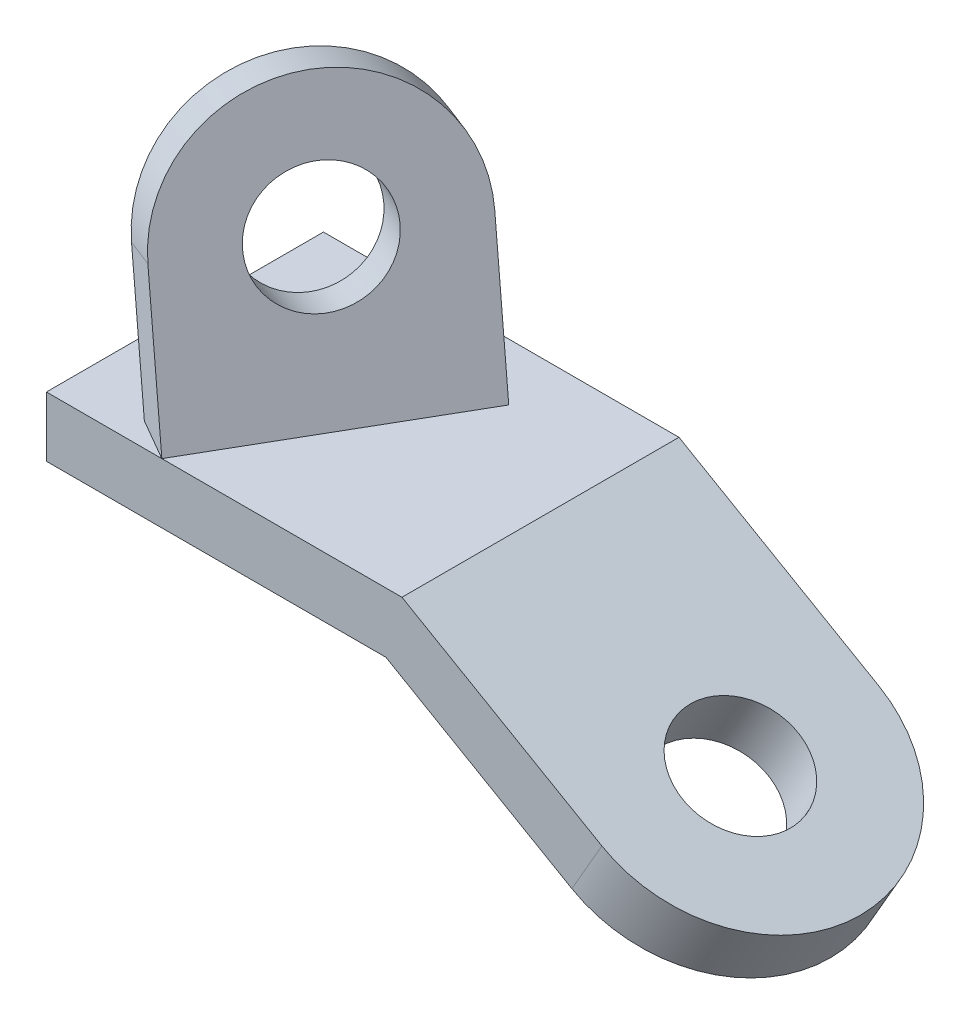
ISO-10303-21;
HEADER;
FILE_DESCRIPTION(('STEP AP214'),'2;1');
FILE_NAME('part.step','',(''),(''),'','','');
FILE_SCHEMA(('AUTOMOTIVE_DESIGN { 1 0 10303 214 1 1 1 1 }'));
ENDSEC;
DATA;
#1=APPLICATION_CONTEXT('core data for automotive mechanical design processes');
#2=APPLICATION_PROTOCOL_DEFINITION('international standard','automotive_design',2000,#1);
#3=PRODUCT_CONTEXT('',#1,'mechanical');
#4=PRODUCT('Part','Part','',(#3));
#5=PRODUCT_RELATED_PRODUCT_CATEGORY('part','',(#4));
#6=PRODUCT_DEFINITION_FORMATION('','',#4);
#7=PRODUCT_DEFINITION_CONTEXT('part definition',#1,'design');
#8=PRODUCT_DEFINITION('design','',#6,#7);
#9=PRODUCT_DEFINITION_SHAPE('','',#8);
#10=(LENGTH_UNIT() NAMED_UNIT(*) SI_UNIT(.MILLI.,.METRE.));
#11=(NAMED_UNIT(*) PLANE_ANGLE_UNIT() SI_UNIT($,.RADIAN.));
#12=(NAMED_UNIT(*) SI_UNIT($,.STERADIAN.) SOLID_ANGLE_UNIT());
#13=UNCERTAINTY_MEASURE_WITH_UNIT(LENGTH_MEASURE(1.E-05),#10,'distance_accuracy_value','');
#14=(GEOMETRIC_REPRESENTATION_CONTEXT(3) GLOBAL_UNCERTAINTY_ASSIGNED_CONTEXT((#13)) GLOBAL_UNIT_ASSIGNED_CONTEXT((#10,
#11,#12)) REPRESENTATION_CONTEXT('',''));
#15=CARTESIAN_POINT('',(0.,0.,0.));
#16=DIRECTION('',(0.,0.,1.));
#17=DIRECTION('',(1.,0.,0.));
#18=AXIS2_PLACEMENT_3D('',#15,#16,#17);
#19=CARTESIAN_POINT('',(0.,0.,30.));
#20=DIRECTION('',(1.,0.,0.));
#21=DIRECTION('',(0.,0.,-1.));
#22=AXIS2_PLACEMENT_3D('',#19,#20,#21);
#23=PLANE('',#22);
#24=DIRECTION('',(0.,-1.,0.));
#25=VECTOR('',#24,1.);
#26=CARTESIAN_POINT('',(0.,0.,-30.));
#27=LINE('',#26,#25);
#28=CARTESIAN_POINT('',(0.,13.,-30.));
#29=VERTEX_POINT('',#28);
#30=CARTESIAN_POINT('',(0.,0.,-30.));
#31=VERTEX_POINT('',#30);
#32=EDGE_CURVE('E207',#29,#31,#27,.T.);
#33=ORIENTED_EDGE('',*,*,#32,.T.);
#34=DIRECTION('',(0.,0.,-1.));
#35=VECTOR('',#34,1.);
#36=CARTESIAN_POINT('',(0.,0.,30.));
#37=LINE('',#36,#35);
#38=CARTESIAN_POINT('',(0.,0.,30.));
#39=VERTEX_POINT('',#38);
#40=EDGE_CURVE('E241',#39,#31,#37,.T.);
#41=ORIENTED_EDGE('',*,*,#40,.F.);
#42=DIRECTION('',(0.,-1.,0.));
#43=VECTOR('',#42,1.);
#44=CARTESIAN_POINT('',(0.,0.,30.));
#45=LINE('',#44,#43);
#46=CARTESIAN_POINT('',(0.,13.,30.));
#47=VERTEX_POINT('',#46);
#48=EDGE_CURVE('E209',#47,#39,#45,.T.);
#49=ORIENTED_EDGE('',*,*,#48,.F.);
#50=DIRECTION('',(0.,0.,-1.));
#51=VECTOR('',#50,1.);
#52=CARTESIAN_POINT('',(0.,13.,30.));
#53=LINE('',#52,#51);
#54=EDGE_CURVE('E223',#47,#29,#53,.T.);
#55=ORIENTED_EDGE('',*,*,#54,.T.);
#56=EDGE_LOOP('',(#33,#41,#49,#55));
#57=FACE_BOUND('',#56,.T.);
#58=ADVANCED_FACE('F82',(#57),#23,.F.);
#59=CARTESIAN_POINT('',(0.,0.,30.));
#60=DIRECTION('',(0.,1.,0.));
#61=DIRECTION('',(0.,0.,1.));
#62=AXIS2_PLACEMENT_3D('',#59,#60,#61);
#63=PLANE('',#62);
#64=DIRECTION('',(1.,0.,0.));
#65=VECTOR('',#64,1.);
#66=CARTESIAN_POINT('',(0.,0.,-30.));
#67=LINE('',#66,#65);
#68=CARTESIAN_POINT('',(73.5166604983954,0.,-30.));
#69=VERTEX_POINT('',#68);
#70=EDGE_CURVE('E229',#31,#69,#67,.T.);
#71=ORIENTED_EDGE('',*,*,#70,.T.);
#72=DIRECTION('',(0.,0.,-1.));
#73=VECTOR('',#72,1.);
#74=CARTESIAN_POINT('',(73.5166604983954,0.,30.));
#75=LINE('',#74,#73);
#76=CARTESIAN_POINT('',(73.5166604983954,0.,30.));
#77=VERTEX_POINT('',#76);
#78=EDGE_CURVE('E242',#77,#69,#75,.T.);
#79=ORIENTED_EDGE('',*,*,#78,.F.);
#80=DIRECTION('',(1.,0.,0.));
#81=VECTOR('',#80,1.);
#82=CARTESIAN_POINT('',(0.,0.,30.));
#83=LINE('',#82,#81);
#84=EDGE_CURVE('E213',#39,#77,#83,.T.);
#85=ORIENTED_EDGE('',*,*,#84,.F.);
#86=ORIENTED_EDGE('',*,*,#40,.T.);
#87=EDGE_LOOP('',(#71,#79,#85,#86));
#88=FACE_BOUND('',#87,.T.);
#89=ADVANCED_FACE('F249',(#88),#63,.F.);
#90=CARTESIAN_POINT('',(73.5166604983954,0.,30.));
#91=DIRECTION('',(0.500000000000001,0.866025403784438,0.));
#92=DIRECTION('',(-0.866025403784438,0.500000000000001,0.));
#93=AXIS2_PLACEMENT_3D('',#90,#91,#92);
#94=PLANE('',#93);
#95=CARTESIAN_POINT('',(113.801270189222,-23.2583302491977,0.));
#96=DIRECTION('',(0.500000000000001,0.866025403784438,0.));
#97=DIRECTION('',(-0.866025403784438,0.500000000000001,0.));
#98=AXIS2_PLACEMENT_3D('',#95,#96,#97);
#99=CIRCLE('',#98,12.5);
#100=CARTESIAN_POINT('',(102.975952641916,-17.0083302491977,0.));
#101=VERTEX_POINT('',#100);
#102=EDGE_CURVE('E206',#101,#101,#99,.F.);
#103=ORIENTED_EDGE('',*,*,#102,.F.);
#104=EDGE_LOOP('',(#103));
#105=FACE_BOUND('',#104,.T.);
#106=CARTESIAN_POINT('',(113.801270189222,-23.2583302491977,0.));
#107=DIRECTION('',(0.500000000000001,0.866025403784438,0.));
#108=DIRECTION('',(-0.866025403784438,0.500000000000001,0.));
#109=AXIS2_PLACEMENT_3D('',#106,#107,#108);
#110=CIRCLE('',#109,30.);
#111=CARTESIAN_POINT('',(113.801270189222,-23.2583302491977,-30.));
#112=VERTEX_POINT('',#111);
#113=CARTESIAN_POINT('',(113.801270189222,-23.2583302491977,30.));
#114=VERTEX_POINT('',#113);
#115=EDGE_CURVE('E196',#112,#114,#110,.F.);
#116=ORIENTED_EDGE('',*,*,#115,.T.);
#117=DIRECTION('',(0.866025403784438,-0.500000000000001,0.));
#118=VECTOR('',#117,1.);
#119=CARTESIAN_POINT('',(73.5166604983954,0.,30.));
#120=LINE('',#119,#118);
#121=EDGE_CURVE('E216',#77,#114,#120,.T.);
#122=ORIENTED_EDGE('',*,*,#121,.F.);
#123=ORIENTED_EDGE('',*,*,#78,.T.);
#124=DIRECTION('',(0.866025403784438,-0.500000000000001,0.));
#125=VECTOR('',#124,1.);
#126=CARTESIAN_POINT('',(73.5166604983954,0.,-30.));
#127=LINE('',#126,#125);
#128=EDGE_CURVE('E228',#69,#112,#127,.T.);
#129=ORIENTED_EDGE('',*,*,#128,.T.);
#130=EDGE_LOOP('',(#116,#122,#123,#129));
#131=FACE_BOUND('',#130,.T.);
#132=ADVANCED_FACE('F261',(#105,#131),#94,.F.);
#133=CARTESIAN_POINT('',(77.,13.,30.));
#134=DIRECTION('',(-0.500000000000001,-0.866025403784438,0.));
#135=DIRECTION('',(0.866025403784438,-0.500000000000001,0.));
#136=AXIS2_PLACEMENT_3D('',#133,#134,#135);
#137=PLANE('',#136);
#138=CARTESIAN_POINT('',(120.301270189222,-12.,0.));
#139=DIRECTION('',(0.500000000000001,0.866025403784438,0.));
#140=DIRECTION('',(-0.866025403784438,0.500000000000001,0.));
#141=AXIS2_PLACEMENT_3D('',#138,#139,#140);
#142=CIRCLE('',#141,12.5);
#143=CARTESIAN_POINT('',(109.475952641916,-5.75000000000001,0.));
#144=VERTEX_POINT('',#143);
#145=EDGE_CURVE('E201',#144,#144,#142,.T.);
#146=ORIENTED_EDGE('',*,*,#145,.F.);
#147=EDGE_LOOP('',(#146));
#148=FACE_BOUND('',#147,.T.);
#149=DIRECTION('',(-0.866025403784438,0.500000000000001,0.));
#150=VECTOR('',#149,1.);
#151=CARTESIAN_POINT('',(77.,13.,30.));
#152=LINE('',#151,#150);
#153=CARTESIAN_POINT('',(120.301270189222,-12.,30.));
#154=VERTEX_POINT('',#153);
#155=CARTESIAN_POINT('',(77.,13.,30.));
#156=VERTEX_POINT('',#155);
#157=EDGE_CURVE('E218',#154,#156,#152,.T.);
#158=ORIENTED_EDGE('',*,*,#157,.F.);
#159=CARTESIAN_POINT('',(120.301270189222,-12.,0.));
#160=DIRECTION('',(0.500000000000001,0.866025403784438,0.));
#161=DIRECTION('',(-0.866025403784438,0.500000000000001,0.));
#162=AXIS2_PLACEMENT_3D('',#159,#160,#161);
#163=CIRCLE('',#162,30.);
#164=CARTESIAN_POINT('',(120.301270189222,-12.,-30.));
#165=VERTEX_POINT('',#164);
#166=EDGE_CURVE('E103',#154,#165,#163,.T.);
#167=ORIENTED_EDGE('',*,*,#166,.T.);
#168=DIRECTION('',(-0.866025403784438,0.500000000000001,0.));
#169=VECTOR('',#168,1.);
#170=CARTESIAN_POINT('',(77.,13.,-30.));
#171=LINE('',#170,#169);
#172=CARTESIAN_POINT('',(77.,13.,-30.));
#173=VERTEX_POINT('',#172);
#174=EDGE_CURVE('E234',#165,#173,#171,.T.);
#175=ORIENTED_EDGE('',*,*,#174,.T.);
#176=DIRECTION('',(0.,0.,-1.));
#177=VECTOR('',#176,1.);
#178=CARTESIAN_POINT('',(77.,13.,30.));
#179=LINE('',#178,#177);
#180=EDGE_CURVE('E236',#156,#173,#179,.T.);
#181=ORIENTED_EDGE('',*,*,#180,.F.);
#182=EDGE_LOOP('',(#158,#167,#175,#181));
#183=FACE_BOUND('',#182,.T.);
#184=ADVANCED_FACE('F272',(#148,#183),#137,.F.);
#185=CARTESIAN_POINT('',(0.,13.,30.));
#186=DIRECTION('',(0.,-1.,0.));
#187=DIRECTION('',(0.,0.,-1.));
#188=AXIS2_PLACEMENT_3D('',#185,#186,#187);
#189=PLANE('',#188);
#190=DIRECTION('',(-0.500000000000004,0.,0.866025403784436));
#191=VECTOR('',#190,1.);
#192=CARTESIAN_POINT('',(9.78424527831939,13.,35.6489366452551));
#193=LINE('',#192,#191);
#194=CARTESIAN_POINT('',(43.5342452783197,13.,-22.8077781101945));
#195=VERTEX_POINT('',#194);
#196=CARTESIAN_POINT('',(16.0342452783195,13.,24.8236190979495));
#197=VERTEX_POINT('',#196);
#198=EDGE_CURVE('E86',#195,#197,#193,.T.);
#199=ORIENTED_EDGE('',*,*,#198,.F.);
#200=DIRECTION('',(0.866025403784436,0.,0.500000000000004));
#201=VECTOR('',#200,1.);
#202=CARTESIAN_POINT('',(33.7500000000003,13.,-28.4567147554496));
#203=LINE('',#202,#201);
#204=CARTESIAN_POINT('',(52.5000000000002,13.,-17.631397208144));
#205=VERTEX_POINT('',#204);
#206=EDGE_CURVE('E12',#195,#205,#203,.T.);
#207=ORIENTED_EDGE('',*,*,#206,.T.);
#208=DIRECTION('',(0.500000000000004,0.,-0.866025403784436));
#209=VECTOR('',#208,1.);
#210=CARTESIAN_POINT('',(52.5000000000002,13.,-17.631397208144));
#211=LINE('',#210,#209);
#212=CARTESIAN_POINT('',(25.,13.,30.));
#213=VERTEX_POINT('',#212);
#214=EDGE_CURVE('E182',#213,#205,#211,.T.);
#215=ORIENTED_EDGE('',*,*,#214,.F.);
#216=DIRECTION('',(-1.,0.,0.));
#217=VECTOR('',#216,1.);
#218=CARTESIAN_POINT('',(0.,13.,30.));
#219=LINE('',#218,#217);
#220=EDGE_CURVE('E225',#156,#213,#219,.T.);
#221=ORIENTED_EDGE('',*,*,#220,.F.);
#222=ORIENTED_EDGE('',*,*,#180,.T.);
#223=DIRECTION('',(-1.,0.,0.));
#224=VECTOR('',#223,1.);
#225=CARTESIAN_POINT('',(0.,13.,-30.));
#226=LINE('',#225,#224);
#227=EDGE_CURVE('E212',#173,#29,#226,.T.);
#228=ORIENTED_EDGE('',*,*,#227,.T.);
#229=ORIENTED_EDGE('',*,*,#54,.F.);
#230=EDGE_CURVE('E222',#213,#47,#219,.T.);
#231=ORIENTED_EDGE('',*,*,#230,.F.);
#232=DIRECTION('',(-0.866025403784436,0.,-0.500000000000004));
#233=VECTOR('',#232,1.);
#234=CARTESIAN_POINT('',(6.2500000000001,13.,19.1746824526945));
#235=LINE('',#234,#233);
#236=EDGE_CURVE('E194',#213,#197,#235,.T.);
#237=ORIENTED_EDGE('',*,*,#236,.T.);
#238=EDGE_LOOP('',(#199,#207,#215,#221,#222,#228,#229,#231,#237));
#239=FACE_BOUND('',#238,.T.);
#240=ADVANCED_FACE('F267',(#239),#189,.F.);
#241=CARTESIAN_POINT('',(0.,0.,30.));
#242=DIRECTION('',(0.,0.,-1.));
#243=DIRECTION('',(-1.,0.,0.));
#244=AXIS2_PLACEMENT_3D('',#241,#242,#243);
#245=PLANE('',#244);
#246=ORIENTED_EDGE('',*,*,#121,.T.);
#247=DIRECTION('',(0.500000000000001,0.866025403784438,0.));
#248=VECTOR('',#247,1.);
#249=CARTESIAN_POINT('',(78.8550791008311,-83.7869087453011,30.));
#250=LINE('',#249,#248);
#251=EDGE_CURVE('E198',#114,#154,#250,.T.);
#252=ORIENTED_EDGE('',*,*,#251,.T.);
#253=ORIENTED_EDGE('',*,*,#157,.T.);
#254=ORIENTED_EDGE('',*,*,#220,.T.);
#255=ORIENTED_EDGE('',*,*,#230,.T.);
#256=ORIENTED_EDGE('',*,*,#48,.T.);
#257=ORIENTED_EDGE('',*,*,#84,.T.);
#258=EDGE_LOOP('',(#246,#252,#253,#254,#255,#256,#257));
#259=FACE_BOUND('',#258,.T.);
#260=ADVANCED_FACE('F262',(#259),#245,.F.);
#261=CARTESIAN_POINT('',(0.,0.,-30.));
#262=DIRECTION('',(0.,0.,-1.));
#263=DIRECTION('',(-1.,0.,0.));
#264=AXIS2_PLACEMENT_3D('',#261,#262,#263);
#265=PLANE('',#264);
#266=DIRECTION('',(0.500000000000001,0.866025403784438,0.));
#267=VECTOR('',#266,1.);
#268=CARTESIAN_POINT('',(78.8550791008311,-83.7869087453011,-30.));
#269=LINE('',#268,#267);
#270=EDGE_CURVE('E203',#112,#165,#269,.T.);
#271=ORIENTED_EDGE('',*,*,#270,.F.);
#272=ORIENTED_EDGE('',*,*,#128,.F.);
#273=ORIENTED_EDGE('',*,*,#70,.F.);
#274=ORIENTED_EDGE('',*,*,#32,.F.);
#275=ORIENTED_EDGE('',*,*,#227,.F.);
#276=ORIENTED_EDGE('',*,*,#174,.F.);
#277=EDGE_LOOP('',(#271,#272,#273,#274,#275,#276));
#278=FACE_BOUND('',#277,.T.);
#279=ADVANCED_FACE('F260',(#278),#265,.T.);
#280=CARTESIAN_POINT('',(78.8550791008311,-83.7869087453011,0.));
#281=DIRECTION('',(0.500000000000001,0.866025403784438,0.));
#282=DIRECTION('',(-0.866025403784438,0.500000000000001,0.));
#283=AXIS2_PLACEMENT_3D('',#280,#281,#282);
#284=CYLINDRICAL_SURFACE('',#283,12.5);
#285=ORIENTED_EDGE('',*,*,#145,.T.);
#286=EDGE_LOOP('',(#285));
#287=FACE_BOUND('',#286,.T.);
#288=ORIENTED_EDGE('',*,*,#102,.T.);
#289=EDGE_LOOP('',(#288));
#290=FACE_BOUND('',#289,.T.);
#291=ADVANCED_FACE('F326',(#287,#290),#284,.F.);
#292=CARTESIAN_POINT('',(78.8550791008311,-83.7869087453011,0.));
#293=DIRECTION('',(0.500000000000001,0.866025403784438,0.));
#294=DIRECTION('',(-0.866025403784438,0.500000000000001,0.));
#295=AXIS2_PLACEMENT_3D('',#292,#293,#294);
#296=CYLINDRICAL_SURFACE('',#295,30.);
#297=ORIENTED_EDGE('',*,*,#270,.T.);
#298=ORIENTED_EDGE('',*,*,#166,.F.);
#299=ORIENTED_EDGE('',*,*,#251,.F.);
#300=ORIENTED_EDGE('',*,*,#115,.F.);
#301=EDGE_LOOP('',(#297,#298,#299,#300));
#302=FACE_BOUND('',#301,.T.);
#303=ADVANCED_FACE('F333',(#302),#296,.T.);
#304=CARTESIAN_POINT('',(36.9622331852778,41.321435990225,-26.6021310612297));
#305=DIRECTION('',(0.500000000000004,0.,-0.866025403784436));
#306=DIRECTION('',(-0.866025403784436,0.,-0.500000000000004));
#307=AXIS2_PLACEMENT_3D('',#304,#305,#306);
#308=PLANE('',#307);
#309=ORIENTED_EDGE('',*,*,#206,.F.);
#310=DIRECTION('',(-0.22414386804201,0.965925826289069,-0.12940952255126));
#311=VECTOR('',#310,1.);
#312=CARTESIAN_POINT('',(36.9622331852778,41.321435990225,-26.6021310612297));
#313=LINE('',#312,#311);
#314=CARTESIAN_POINT('',(36.9622331852778,41.321435990225,-26.6021310612297));
#315=VERTEX_POINT('',#314);
#316=EDGE_CURVE('E170',#195,#315,#313,.T.);
#317=ORIENTED_EDGE('',*,*,#316,.T.);
#318=DIRECTION('',(0.836516303737806,0.258819045102518,0.482962913144538));
#319=VECTOR('',#318,1.);
#320=CARTESIAN_POINT('',(36.9622331852778,41.321435990225,-26.6021310612297));
#321=LINE('',#320,#319);
#322=CARTESIAN_POINT('',(45.3273962226559,43.9096264412502,-21.7725019297843));
#323=VERTEX_POINT('',#322);
#324=EDGE_CURVE('E167',#315,#323,#321,.T.);
#325=ORIENTED_EDGE('',*,*,#324,.T.);
#326=DIRECTION('',(-0.22414386804201,0.965925826289069,-0.12940952255126));
#327=VECTOR('',#326,1.);
#328=CARTESIAN_POINT('',(45.3273962226559,43.9096264412502,-21.7725019297843));
#329=LINE('',#328,#327);
#330=EDGE_CURVE('E179',#205,#323,#329,.T.);
#331=ORIENTED_EDGE('',*,*,#330,.F.);
#332=EDGE_LOOP('',(#309,#317,#325,#331));
#333=FACE_BOUND('',#332,.T.);
#334=ADVANCED_FACE('F341',(#333),#308,.T.);
#335=CARTESIAN_POINT('',(23.2122331852777,41.321435990225,-2.7864324571577));
#336=DIRECTION('',(0.836516303737806,0.258819045102518,0.482962913144538));
#337=DIRECTION('',(0.500000000000004,0.,-0.866025403784436));
#338=AXIS2_PLACEMENT_3D('',#335,#336,#337);
#339=PLANE('',#338);
#340=CARTESIAN_POINT('',(23.2122331852777,41.321435990225,-2.7864324571577));
#341=DIRECTION('',(0.836516303737806,0.258819045102518,0.482962913144538));
#342=DIRECTION('',(0.500000000000004,0.,-0.866025403784436));
#343=AXIS2_PLACEMENT_3D('',#340,#341,#342);
#344=CIRCLE('',#343,12.5);
#345=CARTESIAN_POINT('',(29.4622331852778,41.321435990225,-13.6117500044632));
#346=VERTEX_POINT('',#345);
#347=EDGE_CURVE('E188',#346,#346,#344,.T.);
#348=ORIENTED_EDGE('',*,*,#347,.T.);
#349=EDGE_LOOP('',(#348));
#350=FACE_BOUND('',#349,.T.);
#351=ORIENTED_EDGE('',*,*,#316,.F.);
#352=ORIENTED_EDGE('',*,*,#198,.T.);
#353=DIRECTION('',(0.22414386804201,-0.965925826289069,0.12940952255126));
#354=VECTOR('',#353,1.);
#355=CARTESIAN_POINT('',(16.6348369626219,10.4118095489748,25.1703708685546));
#356=LINE('',#355,#354);
#357=CARTESIAN_POINT('',(9.4622331852776,41.321435990225,21.0292661469143));
#358=VERTEX_POINT('',#357);
#359=EDGE_CURVE('E161',#358,#197,#356,.T.);
#360=ORIENTED_EDGE('',*,*,#359,.F.);
#361=CARTESIAN_POINT('',(23.2122331852777,41.321435990225,-2.7864324571577));
#362=DIRECTION('',(0.836516303737806,0.258819045102518,0.482962913144538));
#363=DIRECTION('',(0.500000000000004,0.,-0.866025403784436));
#364=AXIS2_PLACEMENT_3D('',#361,#362,#363);
#365=CIRCLE('',#364,27.5);
#366=EDGE_CURVE('E174',#315,#358,#365,.T.);
#367=ORIENTED_EDGE('',*,*,#366,.F.);
#368=EDGE_LOOP('',(#351,#352,#360,#367));
#369=FACE_BOUND('',#368,.T.);
#370=ADVANCED_FACE('F175',(#350,#369),#339,.F.);
#371=CARTESIAN_POINT('',(16.6348369626219,10.4118095489748,25.1703708685546));
#372=DIRECTION('',(-0.500000000000004,0.,0.866025403784436));
#373=DIRECTION('',(0.866025403784436,0.,0.500000000000004));
#374=AXIS2_PLACEMENT_3D('',#371,#372,#373);
#375=PLANE('',#374);
#376=ORIENTED_EDGE('',*,*,#236,.F.);
#377=DIRECTION('',(0.22414386804201,-0.965925826289069,0.12940952255126));
#378=VECTOR('',#377,1.);
#379=CARTESIAN_POINT('',(25.,13.,30.));
#380=LINE('',#379,#378);
#381=CARTESIAN_POINT('',(17.8273962226557,43.9096264412502,25.8588952783597));
#382=VERTEX_POINT('',#381);
#383=EDGE_CURVE('E92',#382,#213,#380,.T.);
#384=ORIENTED_EDGE('',*,*,#383,.F.);
#385=DIRECTION('',(0.836516303737806,0.258819045102518,0.482962913144538));
#386=VECTOR('',#385,1.);
#387=CARTESIAN_POINT('',(9.4622331852776,41.321435990225,21.0292661469143));
#388=LINE('',#387,#386);
#389=EDGE_CURVE('E158',#358,#382,#388,.T.);
#390=ORIENTED_EDGE('',*,*,#389,.F.);
#391=ORIENTED_EDGE('',*,*,#359,.T.);
#392=EDGE_LOOP('',(#376,#384,#390,#391));
#393=FACE_BOUND('',#392,.T.);
#394=ADVANCED_FACE('F159',(#393),#375,.T.);
#395=CARTESIAN_POINT('',(23.2122331852777,41.321435990225,-2.7864324571577));
#396=DIRECTION('',(0.836516303737806,0.258819045102518,0.482962913144538));
#397=DIRECTION('',(0.500000000000004,0.,-0.866025403784436));
#398=AXIS2_PLACEMENT_3D('',#395,#396,#397);
#399=CYLINDRICAL_SURFACE('',#398,27.5);
#400=CARTESIAN_POINT('',(31.5773962226558,43.9096264412502,2.04319667428768));
#401=DIRECTION('',(0.836516303737806,0.258819045102518,0.482962913144538));
#402=DIRECTION('',(0.500000000000004,0.,-0.866025403784436));
#403=AXIS2_PLACEMENT_3D('',#400,#401,#402);
#404=CIRCLE('',#403,27.5);
#405=EDGE_CURVE('E189',#323,#382,#404,.T.);
#406=ORIENTED_EDGE('',*,*,#405,.F.);
#407=ORIENTED_EDGE('',*,*,#324,.F.);
#408=ORIENTED_EDGE('',*,*,#366,.T.);
#409=ORIENTED_EDGE('',*,*,#389,.T.);
#410=EDGE_LOOP('',(#406,#407,#408,#409));
#411=FACE_BOUND('',#410,.T.);
#412=ADVANCED_FACE('F180',(#411),#399,.T.);
#413=CARTESIAN_POINT('',(31.5773962226558,43.9096264412502,2.04319667428768));
#414=DIRECTION('',(0.836516303737806,0.258819045102518,0.482962913144538));
#415=DIRECTION('',(0.500000000000004,0.,-0.866025403784436));
#416=AXIS2_PLACEMENT_3D('',#413,#414,#415);
#417=PLANE('',#416);
#418=CARTESIAN_POINT('',(31.5773962226558,43.9096264412502,2.04319667428768));
#419=DIRECTION('',(0.836516303737806,0.258819045102518,0.482962913144538));
#420=DIRECTION('',(0.500000000000004,0.,-0.866025403784436));
#421=AXIS2_PLACEMENT_3D('',#418,#419,#420);
#422=CIRCLE('',#421,12.5);
#423=CARTESIAN_POINT('',(37.8273962226558,43.9096264412502,-8.78212087301777));
#424=VERTEX_POINT('',#423);
#425=EDGE_CURVE('E184',#424,#424,#422,.T.);
#426=ORIENTED_EDGE('',*,*,#425,.F.);
#427=EDGE_LOOP('',(#426));
#428=FACE_BOUND('',#427,.T.);
#429=ORIENTED_EDGE('',*,*,#405,.T.);
#430=ORIENTED_EDGE('',*,*,#383,.T.);
#431=ORIENTED_EDGE('',*,*,#214,.T.);
#432=ORIENTED_EDGE('',*,*,#330,.T.);
#433=EDGE_LOOP('',(#429,#430,#431,#432));
#434=FACE_BOUND('',#433,.T.);
#435=ADVANCED_FACE('F381',(#428,#434),#417,.T.);
#436=CARTESIAN_POINT('',(23.2122331852777,41.321435990225,-2.7864324571577));
#437=DIRECTION('',(0.836516303737806,0.258819045102518,0.482962913144538));
#438=DIRECTION('',(0.500000000000004,0.,-0.866025403784436));
#439=AXIS2_PLACEMENT_3D('',#436,#437,#438);
#440=CYLINDRICAL_SURFACE('',#439,12.5);
#441=ORIENTED_EDGE('',*,*,#347,.F.);
#442=EDGE_LOOP('',(#441));
#443=FACE_BOUND('',#442,.T.);
#444=ORIENTED_EDGE('',*,*,#425,.T.);
#445=EDGE_LOOP('',(#444));
#446=FACE_BOUND('',#445,.T.);
#447=ADVANCED_FACE('F388',(#443,#446),#440,.F.);
#448=CLOSED_SHELL('',(#58,#89,#132,#184,#240,#260,#279,#291,#303,#334,#370,#394,#412,#435,#447));
#449=MANIFOLD_SOLID_BREP('B2',#448);
#450=ADVANCED_BREP_SHAPE_REPRESENTATION('',(#18,#449),#14);
#451=SHAPE_DEFINITION_REPRESENTATION(#9,#450);
ENDSEC;
END-ISO-10303-21;
